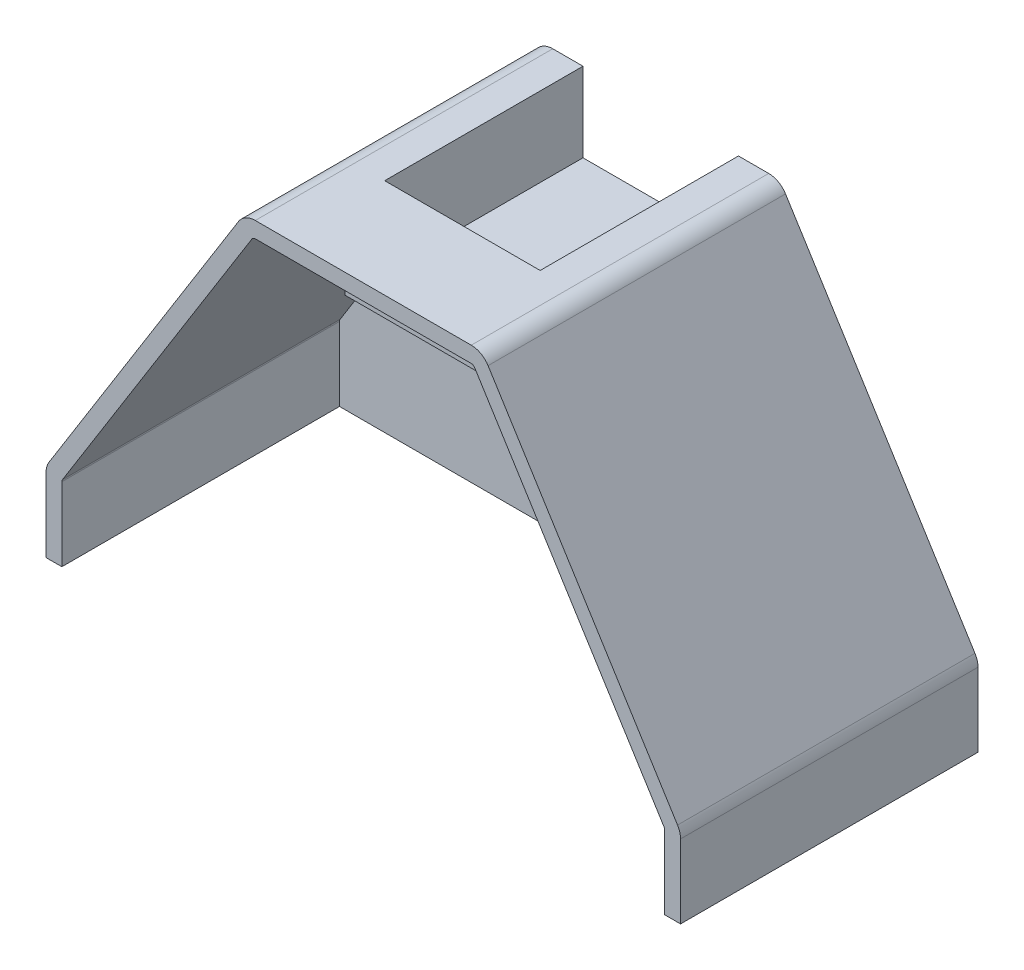
ISO-10303-21;
HEADER;
FILE_DESCRIPTION(('STEP AP214'),'2;1');
FILE_NAME('part.step','',(''),(''),'','','');
FILE_SCHEMA(('AUTOMOTIVE_DESIGN { 1 0 10303 214 1 1 1 1 }'));
ENDSEC;
DATA;
#1=APPLICATION_CONTEXT('core data for automotive mechanical design processes');
#2=APPLICATION_PROTOCOL_DEFINITION('international standard','automotive_design',2000,#1);
#3=PRODUCT_CONTEXT('',#1,'mechanical');
#4=PRODUCT('Part','Part','',(#3));
#5=PRODUCT_RELATED_PRODUCT_CATEGORY('part','',(#4));
#6=PRODUCT_DEFINITION_FORMATION('','',#4);
#7=PRODUCT_DEFINITION_CONTEXT('part definition',#1,'design');
#8=PRODUCT_DEFINITION('design','',#6,#7);
#9=PRODUCT_DEFINITION_SHAPE('','',#8);
#10=(LENGTH_UNIT() NAMED_UNIT(*) SI_UNIT(.MILLI.,.METRE.));
#11=(NAMED_UNIT(*) PLANE_ANGLE_UNIT() SI_UNIT($,.RADIAN.));
#12=(NAMED_UNIT(*) SI_UNIT($,.STERADIAN.) SOLID_ANGLE_UNIT());
#13=UNCERTAINTY_MEASURE_WITH_UNIT(LENGTH_MEASURE(1.E-05),#10,'distance_accuracy_value','');
#14=(GEOMETRIC_REPRESENTATION_CONTEXT(3) GLOBAL_UNCERTAINTY_ASSIGNED_CONTEXT((#13)) GLOBAL_UNIT_ASSIGNED_CONTEXT((#10,
#11,#12)) REPRESENTATION_CONTEXT('',''));
#15=CARTESIAN_POINT('',(0.,0.,0.));
#16=DIRECTION('',(0.,0.,1.));
#17=DIRECTION('',(1.,0.,0.));
#18=AXIS2_PLACEMENT_3D('',#15,#16,#17);
#19=CARTESIAN_POINT('',(-30.,0.,5.));
#20=DIRECTION('',(0.847998304005088,-0.52999894000318,0.));
#21=DIRECTION('',(0.52999894000318,0.847998304005088,0.));
#22=AXIS2_PLACEMENT_3D('',#19,#20,#21);
#23=PLANE('',#22);
#24=DIRECTION('',(-0.52999894000318,-0.847998304005088,0.));
#25=VECTOR('',#24,1.);
#26=CARTESIAN_POINT('',(-30.,0.,0.));
#27=LINE('',#26,#25);
#28=CARTESIAN_POINT('',(-31.4687533124901,-2.3500052999841,0.));
#29=VERTEX_POINT('',#28);
#30=CARTESIAN_POINT('',(-79.2399915200254,-78.7839864320407,0.));
#31=VERTEX_POINT('',#30);
#32=EDGE_CURVE('E382',#29,#31,#27,.T.);
#33=ORIENTED_EDGE('',*,*,#32,.T.);
#34=DIRECTION('',(0.,0.,-1.));
#35=VECTOR('',#34,1.);
#36=CARTESIAN_POINT('',(-79.2399915200254,-78.7839864320407,5.));
#37=LINE('',#36,#35);
#38=CARTESIAN_POINT('',(-79.2399915200254,-78.7839864320407,75.));
#39=VERTEX_POINT('',#38);
#40=EDGE_CURVE('E434',#31,#39,#37,.F.);
#41=ORIENTED_EDGE('',*,*,#40,.T.);
#42=DIRECTION('',(-0.52999894000318,-0.847998304005088,0.));
#43=VECTOR('',#42,1.);
#44=CARTESIAN_POINT('',(-31.4687533124901,-2.3500052999841,75.));
#45=LINE('',#44,#43);
#46=CARTESIAN_POINT('',(-31.4687533124901,-2.3500052999841,75.));
#47=VERTEX_POINT('',#46);
#48=EDGE_CURVE('E278',#47,#39,#45,.T.);
#49=ORIENTED_EDGE('',*,*,#48,.F.);
#50=DIRECTION('',(0.,0.,-1.));
#51=VECTOR('',#50,1.);
#52=CARTESIAN_POINT('',(-31.4687533124901,-2.3500052999841,5.));
#53=LINE('',#52,#51);
#54=EDGE_CURVE('E406',#47,#29,#53,.T.);
#55=ORIENTED_EDGE('',*,*,#54,.T.);
#56=EDGE_LOOP('',(#33,#41,#49,#55));
#57=FACE_BOUND('',#56,.T.);
#58=ADVANCED_FACE('F35',(#57),#23,.F.);
#59=CARTESIAN_POINT('',(-80.,-100.,5.));
#60=DIRECTION('',(1.,0.,0.));
#61=DIRECTION('',(0.,0.,-1.));
#62=AXIS2_PLACEMENT_3D('',#59,#60,#61);
#63=PLANE('',#62);
#64=DIRECTION('',(0.,0.,-1.));
#65=VECTOR('',#64,1.);
#66=CARTESIAN_POINT('',(-80.,-100.,5.));
#67=LINE('',#66,#65);
#68=CARTESIAN_POINT('',(-80.,-100.,75.));
#69=VERTEX_POINT('',#68);
#70=CARTESIAN_POINT('',(-80.,-100.,0.));
#71=VERTEX_POINT('',#70);
#72=EDGE_CURVE('E403',#69,#71,#67,.T.);
#73=ORIENTED_EDGE('',*,*,#72,.F.);
#74=DIRECTION('',(0.,-1.,0.));
#75=VECTOR('',#74,1.);
#76=CARTESIAN_POINT('',(-80.,-81.4339811320566,75.));
#77=LINE('',#76,#75);
#78=CARTESIAN_POINT('',(-80.,-81.4339811320566,75.));
#79=VERTEX_POINT('',#78);
#80=EDGE_CURVE('E285',#79,#69,#77,.T.);
#81=ORIENTED_EDGE('',*,*,#80,.F.);
#82=DIRECTION('',(0.,0.,-1.));
#83=VECTOR('',#82,1.);
#84=CARTESIAN_POINT('',(-80.,-81.4339811320566,5.));
#85=LINE('',#84,#83);
#86=CARTESIAN_POINT('',(-80.,-81.4339811320566,0.));
#87=VERTEX_POINT('',#86);
#88=EDGE_CURVE('E429',#79,#87,#85,.T.);
#89=ORIENTED_EDGE('',*,*,#88,.T.);
#90=DIRECTION('',(0.,-1.,0.));
#91=VECTOR('',#90,1.);
#92=CARTESIAN_POINT('',(-80.,-100.,0.));
#93=LINE('',#92,#91);
#94=EDGE_CURVE('E389',#87,#71,#93,.T.);
#95=ORIENTED_EDGE('',*,*,#94,.T.);
#96=EDGE_LOOP('',(#73,#81,#89,#95));
#97=FACE_BOUND('',#96,.T.);
#98=ADVANCED_FACE('F502',(#97),#63,.F.);
#99=CARTESIAN_POINT('',(-80.,-100.,5.));
#100=DIRECTION('',(0.,1.,0.));
#101=DIRECTION('',(0.,0.,1.));
#102=AXIS2_PLACEMENT_3D('',#99,#100,#101);
#103=PLANE('',#102);
#104=DIRECTION('',(1.,0.,0.));
#105=VECTOR('',#104,1.);
#106=CARTESIAN_POINT('',(-80.,-100.,0.));
#107=LINE('',#106,#105);
#108=CARTESIAN_POINT('',(80.,-100.,0.));
#109=VERTEX_POINT('',#108);
#110=EDGE_CURVE('E391',#71,#109,#107,.T.);
#111=ORIENTED_EDGE('',*,*,#110,.T.);
#112=DIRECTION('',(0.,0.,-1.));
#113=VECTOR('',#112,1.);
#114=CARTESIAN_POINT('',(80.,-100.,5.));
#115=LINE('',#114,#113);
#116=CARTESIAN_POINT('',(80.,-100.,75.));
#117=VERTEX_POINT('',#116);
#118=EDGE_CURVE('E385',#117,#109,#115,.T.);
#119=ORIENTED_EDGE('',*,*,#118,.F.);
#120=DIRECTION('',(1.,0.,0.));
#121=VECTOR('',#120,1.);
#122=CARTESIAN_POINT('',(76.,-100.,75.));
#123=LINE('',#122,#121);
#124=CARTESIAN_POINT('',(76.,-100.,75.));
#125=VERTEX_POINT('',#124);
#126=EDGE_CURVE('E308',#125,#117,#123,.T.);
#127=ORIENTED_EDGE('',*,*,#126,.F.);
#128=DIRECTION('',(0.,0.,-1.));
#129=VECTOR('',#128,1.);
#130=CARTESIAN_POINT('',(76.,-100.,75.));
#131=LINE('',#130,#129);
#132=CARTESIAN_POINT('',(76.,-100.,5.));
#133=VERTEX_POINT('',#132);
#134=EDGE_CURVE('E326',#125,#133,#131,.T.);
#135=ORIENTED_EDGE('',*,*,#134,.T.);
#136=DIRECTION('',(1.,0.,0.));
#137=VECTOR('',#136,1.);
#138=CARTESIAN_POINT('',(-80.,-100.,5.));
#139=LINE('',#138,#137);
#140=CARTESIAN_POINT('',(-76.,-100.,5.));
#141=VERTEX_POINT('',#140);
#142=EDGE_CURVE('E383',#141,#133,#139,.T.);
#143=ORIENTED_EDGE('',*,*,#142,.F.);
#144=DIRECTION('',(0.,0.,-1.));
#145=VECTOR('',#144,1.);
#146=CARTESIAN_POINT('',(-76.,-100.,75.));
#147=LINE('',#146,#145);
#148=CARTESIAN_POINT('',(-76.,-100.,75.));
#149=VERTEX_POINT('',#148);
#150=EDGE_CURVE('E379',#149,#141,#147,.T.);
#151=ORIENTED_EDGE('',*,*,#150,.F.);
#152=DIRECTION('',(1.,0.,0.));
#153=VECTOR('',#152,1.);
#154=CARTESIAN_POINT('',(-80.,-100.,75.));
#155=LINE('',#154,#153);
#156=EDGE_CURVE('E288',#69,#149,#155,.T.);
#157=ORIENTED_EDGE('',*,*,#156,.F.);
#158=ORIENTED_EDGE('',*,*,#72,.T.);
#159=EDGE_LOOP('',(#111,#119,#127,#135,#143,#151,#157,#158));
#160=FACE_BOUND('',#159,.T.);
#161=ADVANCED_FACE('F479',(#160),#103,.F.);
#162=CARTESIAN_POINT('',(80.,-100.,5.));
#163=DIRECTION('',(-1.,0.,0.));
#164=DIRECTION('',(0.,0.,1.));
#165=AXIS2_PLACEMENT_3D('',#162,#163,#164);
#166=PLANE('',#165);
#167=DIRECTION('',(0.,1.,0.));
#168=VECTOR('',#167,1.);
#169=CARTESIAN_POINT('',(80.,-100.,0.));
#170=LINE('',#169,#168);
#171=CARTESIAN_POINT('',(80.,-81.4339811320566,0.));
#172=VERTEX_POINT('',#171);
#173=EDGE_CURVE('E393',#109,#172,#170,.T.);
#174=ORIENTED_EDGE('',*,*,#173,.T.);
#175=DIRECTION('',(0.,0.,-1.));
#176=VECTOR('',#175,1.);
#177=CARTESIAN_POINT('',(80.,-81.4339811320566,5.));
#178=LINE('',#177,#176);
#179=CARTESIAN_POINT('',(80.,-81.4339811320566,75.));
#180=VERTEX_POINT('',#179);
#181=EDGE_CURVE('E427',#172,#180,#178,.F.);
#182=ORIENTED_EDGE('',*,*,#181,.T.);
#183=DIRECTION('',(0.,1.,0.));
#184=VECTOR('',#183,1.);
#185=CARTESIAN_POINT('',(80.,-100.,75.));
#186=LINE('',#185,#184);
#187=EDGE_CURVE('E311',#117,#180,#186,.T.);
#188=ORIENTED_EDGE('',*,*,#187,.F.);
#189=ORIENTED_EDGE('',*,*,#118,.T.);
#190=EDGE_LOOP('',(#174,#182,#188,#189));
#191=FACE_BOUND('',#190,.T.);
#192=ADVANCED_FACE('F512',(#191),#166,.F.);
#193=CARTESIAN_POINT('',(30.,0.,5.));
#194=DIRECTION('',(-0.847998304005088,-0.52999894000318,0.));
#195=DIRECTION('',(0.52999894000318,-0.847998304005088,0.));
#196=AXIS2_PLACEMENT_3D('',#193,#194,#195);
#197=PLANE('',#196);
#198=DIRECTION('',(0.,0.,-1.));
#199=VECTOR('',#198,1.);
#200=CARTESIAN_POINT('',(31.4687533124901,-2.3500052999841,5.));
#201=LINE('',#200,#199);
#202=CARTESIAN_POINT('',(31.4687533124901,-2.3500052999841,0.));
#203=VERTEX_POINT('',#202);
#204=CARTESIAN_POINT('',(31.4687533124901,-2.3500052999841,75.));
#205=VERTEX_POINT('',#204);
#206=EDGE_CURVE('E420',#203,#205,#201,.F.);
#207=ORIENTED_EDGE('',*,*,#206,.T.);
#208=DIRECTION('',(-0.52999894000318,0.847998304005088,0.));
#209=VECTOR('',#208,1.);
#210=CARTESIAN_POINT('',(79.2399915200255,-78.7839864320407,75.));
#211=LINE('',#210,#209);
#212=CARTESIAN_POINT('',(79.2399915200255,-78.7839864320407,75.));
#213=VERTEX_POINT('',#212);
#214=EDGE_CURVE('E317',#213,#205,#211,.T.);
#215=ORIENTED_EDGE('',*,*,#214,.F.);
#216=DIRECTION('',(0.,0.,-1.));
#217=VECTOR('',#216,1.);
#218=CARTESIAN_POINT('',(79.2399915200255,-78.7839864320407,5.));
#219=LINE('',#218,#217);
#220=CARTESIAN_POINT('',(79.2399915200255,-78.7839864320407,0.));
#221=VERTEX_POINT('',#220);
#222=EDGE_CURVE('E422',#213,#221,#219,.T.);
#223=ORIENTED_EDGE('',*,*,#222,.T.);
#224=DIRECTION('',(-0.52999894000318,0.847998304005088,0.));
#225=VECTOR('',#224,1.);
#226=CARTESIAN_POINT('',(30.,0.,0.));
#227=LINE('',#226,#225);
#228=EDGE_CURVE('E396',#221,#203,#227,.T.);
#229=ORIENTED_EDGE('',*,*,#228,.T.);
#230=EDGE_LOOP('',(#207,#215,#223,#229));
#231=FACE_BOUND('',#230,.T.);
#232=ADVANCED_FACE('F520',(#231),#197,.F.);
#233=CARTESIAN_POINT('',(-30.,0.,5.));
#234=DIRECTION('',(0.,-1.,0.));
#235=DIRECTION('',(0.,0.,-1.));
#236=AXIS2_PLACEMENT_3D('',#233,#234,#235);
#237=PLANE('',#236);
#238=DIRECTION('',(1.,0.,0.));
#239=VECTOR('',#238,1.);
#240=CARTESIAN_POINT('',(-19.6,0.,50.));
#241=LINE('',#240,#239);
#242=CARTESIAN_POINT('',(-19.6,0.,50.));
#243=VERTEX_POINT('',#242);
#244=CARTESIAN_POINT('',(19.6,0.,50.));
#245=VERTEX_POINT('',#244);
#246=EDGE_CURVE('E241',#243,#245,#241,.T.);
#247=ORIENTED_EDGE('',*,*,#246,.F.);
#248=DIRECTION('',(0.,0.,1.));
#249=VECTOR('',#248,1.);
#250=CARTESIAN_POINT('',(-19.6,0.,0.));
#251=LINE('',#250,#249);
#252=CARTESIAN_POINT('',(-19.6,0.,0.));
#253=VERTEX_POINT('',#252);
#254=EDGE_CURVE('E226',#253,#243,#251,.T.);
#255=ORIENTED_EDGE('',*,*,#254,.F.);
#256=DIRECTION('',(-1.,0.,0.));
#257=VECTOR('',#256,1.);
#258=CARTESIAN_POINT('',(-30.,0.,0.));
#259=LINE('',#258,#257);
#260=CARTESIAN_POINT('',(-27.2287617924646,0.,0.));
#261=VERTEX_POINT('',#260);
#262=EDGE_CURVE('E398',#253,#261,#259,.T.);
#263=ORIENTED_EDGE('',*,*,#262,.T.);
#264=DIRECTION('',(0.,0.,-1.));
#265=VECTOR('',#264,1.);
#266=CARTESIAN_POINT('',(-27.2287617924646,0.,5.));
#267=LINE('',#266,#265);
#268=CARTESIAN_POINT('',(-27.2287617924646,0.,75.));
#269=VERTEX_POINT('',#268);
#270=EDGE_CURVE('E412',#261,#269,#267,.F.);
#271=ORIENTED_EDGE('',*,*,#270,.T.);
#272=DIRECTION('',(-1.,0.,0.));
#273=VECTOR('',#272,1.);
#274=CARTESIAN_POINT('',(27.2287617924646,0.,75.));
#275=LINE('',#274,#273);
#276=CARTESIAN_POINT('',(27.2287617924646,0.,75.));
#277=VERTEX_POINT('',#276);
#278=EDGE_CURVE('E323',#277,#269,#275,.T.);
#279=ORIENTED_EDGE('',*,*,#278,.F.);
#280=DIRECTION('',(0.,0.,-1.));
#281=VECTOR('',#280,1.);
#282=CARTESIAN_POINT('',(27.2287617924646,0.,5.));
#283=LINE('',#282,#281);
#284=CARTESIAN_POINT('',(27.2287617924646,0.,0.));
#285=VERTEX_POINT('',#284);
#286=EDGE_CURVE('E414',#277,#285,#283,.T.);
#287=ORIENTED_EDGE('',*,*,#286,.T.);
#288=CARTESIAN_POINT('',(19.6,0.,0.));
#289=VERTEX_POINT('',#288);
#290=EDGE_CURVE('E386',#285,#289,#259,.T.);
#291=ORIENTED_EDGE('',*,*,#290,.T.);
#292=DIRECTION('',(0.,0.,-1.));
#293=VECTOR('',#292,1.);
#294=CARTESIAN_POINT('',(19.6,0.,0.));
#295=LINE('',#294,#293);
#296=EDGE_CURVE('E239',#245,#289,#295,.T.);
#297=ORIENTED_EDGE('',*,*,#296,.F.);
#298=EDGE_LOOP('',(#247,#255,#263,#271,#279,#287,#291,#297));
#299=FACE_BOUND('',#298,.T.);
#300=ADVANCED_FACE('F527',(#299),#237,.F.);
#301=CARTESIAN_POINT('',(0.,0.,5.));
#302=DIRECTION('',(0.,0.,1.));
#303=DIRECTION('',(1.,0.,0.));
#304=AXIS2_PLACEMENT_3D('',#301,#302,#303);
#305=PLANE('',#304);
#306=DIRECTION('',(0.,-1.,0.));
#307=VECTOR('',#306,1.);
#308=CARTESIAN_POINT('',(-24.6,0.,5.));
#309=LINE('',#308,#307);
#310=CARTESIAN_POINT('',(-24.6,-4.,5.));
#311=VERTEX_POINT('',#310);
#312=CARTESIAN_POINT('',(-24.6,-25.,5.));
#313=VERTEX_POINT('',#312);
#314=EDGE_CURVE('E271',#311,#313,#309,.T.);
#315=ORIENTED_EDGE('',*,*,#314,.F.);
#316=DIRECTION('',(1.,0.,0.));
#317=VECTOR('',#316,1.);
#318=CARTESIAN_POINT('',(27.2287617924646,-4.,5.));
#319=LINE('',#318,#317);
#320=CARTESIAN_POINT('',(-27.2287617924646,-4.,5.));
#321=VERTEX_POINT('',#320);
#322=EDGE_CURVE('E339',#321,#311,#319,.T.);
#323=ORIENTED_EDGE('',*,*,#322,.F.);
#324=CARTESIAN_POINT('',(-27.2287617924646,-5.,5.));
#325=DIRECTION('',(0.,0.,-1.));
#326=DIRECTION('',(1.,0.,0.));
#327=AXIS2_PLACEMENT_3D('',#324,#325,#326);
#328=CIRCLE('',#327,1.);
#329=CARTESIAN_POINT('',(-28.0767600964697,-4.47000105999682,5.));
#330=VERTEX_POINT('',#329);
#331=EDGE_CURVE('E335',#330,#321,#328,.T.);
#332=ORIENTED_EDGE('',*,*,#331,.F.);
#333=DIRECTION('',(0.52999894000318,0.847998304005088,0.));
#334=VECTOR('',#333,1.);
#335=CARTESIAN_POINT('',(-28.0767600964697,-4.47000105999682,5.));
#336=LINE('',#335,#334);
#337=CARTESIAN_POINT('',(-75.8479983040051,-80.9039821920534,5.));
#338=VERTEX_POINT('',#337);
#339=EDGE_CURVE('E332',#338,#330,#336,.T.);
#340=ORIENTED_EDGE('',*,*,#339,.F.);
#341=CARTESIAN_POINT('',(-75.,-81.4339811320566,5.));
#342=DIRECTION('',(0.,0.,-1.));
#343=DIRECTION('',(1.,0.,0.));
#344=AXIS2_PLACEMENT_3D('',#341,#342,#343);
#345=CIRCLE('',#344,0.999999999999992);
#346=CARTESIAN_POINT('',(-76.,-81.4339811320566,5.));
#347=VERTEX_POINT('',#346);
#348=EDGE_CURVE('E329',#347,#338,#345,.T.);
#349=ORIENTED_EDGE('',*,*,#348,.F.);
#350=DIRECTION('',(0.,1.,0.));
#351=VECTOR('',#350,1.);
#352=CARTESIAN_POINT('',(-76.,-81.4339811320566,5.));
#353=LINE('',#352,#351);
#354=EDGE_CURVE('E274',#141,#347,#353,.T.);
#355=ORIENTED_EDGE('',*,*,#354,.F.);
#356=ORIENTED_EDGE('',*,*,#142,.T.);
#357=DIRECTION('',(0.,-1.,0.));
#358=VECTOR('',#357,1.);
#359=CARTESIAN_POINT('',(76.,-100.,5.));
#360=LINE('',#359,#358);
#361=CARTESIAN_POINT('',(76.,-81.4339811320566,5.));
#362=VERTEX_POINT('',#361);
#363=EDGE_CURVE('E279',#362,#133,#360,.T.);
#364=ORIENTED_EDGE('',*,*,#363,.F.);
#365=CARTESIAN_POINT('',(75.,-81.4339811320566,5.));
#366=DIRECTION('',(0.,0.,-1.));
#367=DIRECTION('',(1.,0.,0.));
#368=AXIS2_PLACEMENT_3D('',#365,#366,#367);
#369=CIRCLE('',#368,0.999999999999999);
#370=CARTESIAN_POINT('',(75.8479983040051,-80.9039821920534,5.));
#371=VERTEX_POINT('',#370);
#372=EDGE_CURVE('E348',#371,#362,#369,.T.);
#373=ORIENTED_EDGE('',*,*,#372,.F.);
#374=DIRECTION('',(0.52999894000318,-0.847998304005088,0.));
#375=VECTOR('',#374,1.);
#376=CARTESIAN_POINT('',(75.8479983040051,-80.9039821920534,5.));
#377=LINE('',#376,#375);
#378=CARTESIAN_POINT('',(28.0767600964697,-4.47000105999683,5.));
#379=VERTEX_POINT('',#378);
#380=EDGE_CURVE('E345',#379,#371,#377,.T.);
#381=ORIENTED_EDGE('',*,*,#380,.F.);
#382=CARTESIAN_POINT('',(27.2287617924646,-5.,5.));
#383=DIRECTION('',(0.,0.,-1.));
#384=DIRECTION('',(1.,0.,0.));
#385=AXIS2_PLACEMENT_3D('',#382,#383,#384);
#386=CIRCLE('',#385,0.999999999999997);
#387=CARTESIAN_POINT('',(27.2287617924646,-4.,5.));
#388=VERTEX_POINT('',#387);
#389=EDGE_CURVE('E342',#388,#379,#386,.T.);
#390=ORIENTED_EDGE('',*,*,#389,.F.);
#391=CARTESIAN_POINT('',(24.6,-4.,5.));
#392=VERTEX_POINT('',#391);
#393=EDGE_CURVE('E338',#392,#388,#319,.T.);
#394=ORIENTED_EDGE('',*,*,#393,.F.);
#395=DIRECTION('',(0.,1.,0.));
#396=VECTOR('',#395,1.);
#397=CARTESIAN_POINT('',(24.6,0.,5.));
#398=LINE('',#397,#396);
#399=CARTESIAN_POINT('',(24.6,-25.,5.));
#400=VERTEX_POINT('',#399);
#401=EDGE_CURVE('E266',#400,#392,#398,.T.);
#402=ORIENTED_EDGE('',*,*,#401,.F.);
#403=DIRECTION('',(1.,0.,0.));
#404=VECTOR('',#403,1.);
#405=CARTESIAN_POINT('',(0.,-25.,5.));
#406=LINE('',#405,#404);
#407=EDGE_CURVE('E58',#313,#400,#406,.T.);
#408=ORIENTED_EDGE('',*,*,#407,.F.);
#409=EDGE_LOOP('',(#315,#323,#332,#340,#349,#355,#356,#364,#373,#381,#390,#394,#402,#408));
#410=FACE_BOUND('',#409,.T.);
#411=ADVANCED_FACE('F446',(#410),#305,.T.);
#412=CARTESIAN_POINT('',(0.,0.,0.));
#413=DIRECTION('',(0.,0.,1.));
#414=DIRECTION('',(1.,0.,0.));
#415=AXIS2_PLACEMENT_3D('',#412,#413,#414);
#416=PLANE('',#415);
#417=ORIENTED_EDGE('',*,*,#262,.F.);
#418=DIRECTION('',(0.,1.,0.));
#419=VECTOR('',#418,1.);
#420=CARTESIAN_POINT('',(-19.6,-20.,0.));
#421=LINE('',#420,#419);
#422=CARTESIAN_POINT('',(-19.6,-20.,0.));
#423=VERTEX_POINT('',#422);
#424=EDGE_CURVE('E248',#423,#253,#421,.T.);
#425=ORIENTED_EDGE('',*,*,#424,.F.);
#426=DIRECTION('',(-1.,0.,0.));
#427=VECTOR('',#426,1.);
#428=CARTESIAN_POINT('',(-19.6,-20.,0.));
#429=LINE('',#428,#427);
#430=CARTESIAN_POINT('',(19.6,-20.,0.));
#431=VERTEX_POINT('',#430);
#432=EDGE_CURVE('E231',#431,#423,#429,.T.);
#433=ORIENTED_EDGE('',*,*,#432,.F.);
#434=DIRECTION('',(0.,1.,0.));
#435=VECTOR('',#434,1.);
#436=CARTESIAN_POINT('',(19.6,-20.,0.));
#437=LINE('',#436,#435);
#438=EDGE_CURVE('E251',#431,#289,#437,.T.);
#439=ORIENTED_EDGE('',*,*,#438,.T.);
#440=ORIENTED_EDGE('',*,*,#290,.F.);
#441=CARTESIAN_POINT('',(27.2287617924646,-5.,0.));
#442=DIRECTION('',(0.,0.,1.));
#443=DIRECTION('',(1.,0.,0.));
#444=AXIS2_PLACEMENT_3D('',#441,#442,#443);
#445=CIRCLE('',#444,5.);
#446=EDGE_CURVE('E417',#285,#203,#445,.F.);
#447=ORIENTED_EDGE('',*,*,#446,.T.);
#448=ORIENTED_EDGE('',*,*,#228,.F.);
#449=CARTESIAN_POINT('',(75.,-81.4339811320566,0.));
#450=DIRECTION('',(0.,0.,1.));
#451=DIRECTION('',(1.,0.,0.));
#452=AXIS2_PLACEMENT_3D('',#449,#450,#451);
#453=CIRCLE('',#452,5.);
#454=EDGE_CURVE('E425',#221,#172,#453,.F.);
#455=ORIENTED_EDGE('',*,*,#454,.T.);
#456=ORIENTED_EDGE('',*,*,#173,.F.);
#457=ORIENTED_EDGE('',*,*,#110,.F.);
#458=ORIENTED_EDGE('',*,*,#94,.F.);
#459=CARTESIAN_POINT('',(-75.,-81.4339811320566,0.));
#460=DIRECTION('',(0.,0.,1.));
#461=DIRECTION('',(1.,0.,0.));
#462=AXIS2_PLACEMENT_3D('',#459,#460,#461);
#463=CIRCLE('',#462,5.);
#464=EDGE_CURVE('E432',#87,#31,#463,.F.);
#465=ORIENTED_EDGE('',*,*,#464,.T.);
#466=ORIENTED_EDGE('',*,*,#32,.F.);
#467=CARTESIAN_POINT('',(-27.2287617924646,-5.,0.));
#468=DIRECTION('',(0.,0.,1.));
#469=DIRECTION('',(1.,0.,0.));
#470=AXIS2_PLACEMENT_3D('',#467,#468,#469);
#471=CIRCLE('',#470,5.);
#472=EDGE_CURVE('E409',#29,#261,#471,.F.);
#473=ORIENTED_EDGE('',*,*,#472,.T.);
#474=EDGE_LOOP('',(#417,#425,#433,#439,#440,#447,#448,#455,#456,#457,#458,#465,#466,#473));
#475=FACE_BOUND('',#474,.T.);
#476=ADVANCED_FACE('F508',(#475),#416,.F.);
#477=CARTESIAN_POINT('',(-27.2287617924646,-5.,5.));
#478=DIRECTION('',(0.,0.,-1.));
#479=DIRECTION('',(-1.,0.,0.));
#480=AXIS2_PLACEMENT_3D('',#477,#478,#479);
#481=CYLINDRICAL_SURFACE('',#480,5.);
#482=ORIENTED_EDGE('',*,*,#54,.F.);
#483=CARTESIAN_POINT('',(-27.2287617924646,-5.,75.));
#484=DIRECTION('',(0.,0.,1.));
#485=DIRECTION('',(1.,0.,0.));
#486=AXIS2_PLACEMENT_3D('',#483,#484,#485);
#487=CIRCLE('',#486,5.);
#488=EDGE_CURVE('E275',#269,#47,#487,.T.);
#489=ORIENTED_EDGE('',*,*,#488,.F.);
#490=ORIENTED_EDGE('',*,*,#270,.F.);
#491=ORIENTED_EDGE('',*,*,#472,.F.);
#492=EDGE_LOOP('',(#482,#489,#490,#491));
#493=FACE_BOUND('',#492,.T.);
#494=ADVANCED_FACE('F531',(#493),#481,.T.);
#495=CARTESIAN_POINT('',(27.2287617924646,-5.,5.));
#496=DIRECTION('',(0.,0.,-1.));
#497=DIRECTION('',(-1.,0.,0.));
#498=AXIS2_PLACEMENT_3D('',#495,#496,#497);
#499=CYLINDRICAL_SURFACE('',#498,5.);
#500=ORIENTED_EDGE('',*,*,#286,.F.);
#501=CARTESIAN_POINT('',(27.2287617924646,-5.,75.));
#502=DIRECTION('',(0.,0.,1.));
#503=DIRECTION('',(1.,0.,0.));
#504=AXIS2_PLACEMENT_3D('',#501,#502,#503);
#505=CIRCLE('',#504,5.);
#506=EDGE_CURVE('E320',#205,#277,#505,.T.);
#507=ORIENTED_EDGE('',*,*,#506,.F.);
#508=ORIENTED_EDGE('',*,*,#206,.F.);
#509=ORIENTED_EDGE('',*,*,#446,.F.);
#510=EDGE_LOOP('',(#500,#507,#508,#509));
#511=FACE_BOUND('',#510,.T.);
#512=ADVANCED_FACE('F523',(#511),#499,.T.);
#513=CARTESIAN_POINT('',(75.,-81.4339811320566,5.));
#514=DIRECTION('',(0.,0.,-1.));
#515=DIRECTION('',(-1.,0.,0.));
#516=AXIS2_PLACEMENT_3D('',#513,#514,#515);
#517=CYLINDRICAL_SURFACE('',#516,5.);
#518=ORIENTED_EDGE('',*,*,#222,.F.);
#519=CARTESIAN_POINT('',(75.,-81.4339811320566,75.));
#520=DIRECTION('',(0.,0.,1.));
#521=DIRECTION('',(1.,0.,0.));
#522=AXIS2_PLACEMENT_3D('',#519,#520,#521);
#523=CIRCLE('',#522,5.);
#524=EDGE_CURVE('E314',#180,#213,#523,.T.);
#525=ORIENTED_EDGE('',*,*,#524,.F.);
#526=ORIENTED_EDGE('',*,*,#181,.F.);
#527=ORIENTED_EDGE('',*,*,#454,.F.);
#528=EDGE_LOOP('',(#518,#525,#526,#527));
#529=FACE_BOUND('',#528,.T.);
#530=ADVANCED_FACE('F516',(#529),#517,.T.);
#531=CARTESIAN_POINT('',(-75.,-81.4339811320566,5.));
#532=DIRECTION('',(0.,0.,-1.));
#533=DIRECTION('',(-1.,0.,0.));
#534=AXIS2_PLACEMENT_3D('',#531,#532,#533);
#535=CYLINDRICAL_SURFACE('',#534,5.);
#536=ORIENTED_EDGE('',*,*,#88,.F.);
#537=CARTESIAN_POINT('',(-75.,-81.4339811320566,75.));
#538=DIRECTION('',(0.,0.,1.));
#539=DIRECTION('',(1.,0.,0.));
#540=AXIS2_PLACEMENT_3D('',#537,#538,#539);
#541=CIRCLE('',#540,4.99999999999999);
#542=EDGE_CURVE('E282',#39,#79,#541,.T.);
#543=ORIENTED_EDGE('',*,*,#542,.F.);
#544=ORIENTED_EDGE('',*,*,#40,.F.);
#545=ORIENTED_EDGE('',*,*,#464,.F.);
#546=EDGE_LOOP('',(#536,#543,#544,#545));
#547=FACE_BOUND('',#546,.T.);
#548=ADVANCED_FACE('F37',(#547),#535,.T.);
#549=CARTESIAN_POINT('',(-76.,-81.4339811320566,75.));
#550=DIRECTION('',(-1.,0.,0.));
#551=DIRECTION('',(0.,0.,1.));
#552=AXIS2_PLACEMENT_3D('',#549,#550,#551);
#553=PLANE('',#552);
#554=ORIENTED_EDGE('',*,*,#354,.T.);
#555=DIRECTION('',(0.,0.,-1.));
#556=VECTOR('',#555,1.);
#557=CARTESIAN_POINT('',(-76.,-81.4339811320566,75.));
#558=LINE('',#557,#556);
#559=CARTESIAN_POINT('',(-76.,-81.4339811320566,75.));
#560=VERTEX_POINT('',#559);
#561=EDGE_CURVE('E376',#560,#347,#558,.T.);
#562=ORIENTED_EDGE('',*,*,#561,.F.);
#563=DIRECTION('',(0.,1.,0.));
#564=VECTOR('',#563,1.);
#565=CARTESIAN_POINT('',(-76.,-81.4339811320566,75.));
#566=LINE('',#565,#564);
#567=EDGE_CURVE('E290',#149,#560,#566,.T.);
#568=ORIENTED_EDGE('',*,*,#567,.F.);
#569=ORIENTED_EDGE('',*,*,#150,.T.);
#570=EDGE_LOOP('',(#554,#562,#568,#569));
#571=FACE_BOUND('',#570,.T.);
#572=ADVANCED_FACE('F474',(#571),#553,.F.);
#573=CARTESIAN_POINT('',(-75.,-81.4339811320566,75.));
#574=DIRECTION('',(0.,0.,-1.));
#575=DIRECTION('',(-1.,0.,0.));
#576=AXIS2_PLACEMENT_3D('',#573,#574,#575);
#577=CYLINDRICAL_SURFACE('',#576,0.999999999999992);
#578=ORIENTED_EDGE('',*,*,#348,.T.);
#579=DIRECTION('',(0.,0.,-1.));
#580=VECTOR('',#579,1.);
#581=CARTESIAN_POINT('',(-75.8479983040051,-80.9039821920534,75.));
#582=LINE('',#581,#580);
#583=CARTESIAN_POINT('',(-75.8479983040051,-80.9039821920534,75.));
#584=VERTEX_POINT('',#583);
#585=EDGE_CURVE('E373',#584,#338,#582,.T.);
#586=ORIENTED_EDGE('',*,*,#585,.F.);
#587=CARTESIAN_POINT('',(-75.,-81.4339811320566,75.));
#588=DIRECTION('',(0.,0.,-1.));
#589=DIRECTION('',(1.,0.,0.));
#590=AXIS2_PLACEMENT_3D('',#587,#588,#589);
#591=CIRCLE('',#590,0.999999999999992);
#592=EDGE_CURVE('E292',#560,#584,#591,.T.);
#593=ORIENTED_EDGE('',*,*,#592,.F.);
#594=ORIENTED_EDGE('',*,*,#561,.T.);
#595=EDGE_LOOP('',(#578,#586,#593,#594));
#596=FACE_BOUND('',#595,.T.);
#597=ADVANCED_FACE('F470',(#596),#577,.F.);
#598=CARTESIAN_POINT('',(-28.0767600964697,-4.47000105999682,75.));
#599=DIRECTION('',(-0.847998304005088,0.52999894000318,0.));
#600=DIRECTION('',(-0.52999894000318,-0.847998304005088,0.));
#601=AXIS2_PLACEMENT_3D('',#598,#599,#600);
#602=PLANE('',#601);
#603=ORIENTED_EDGE('',*,*,#339,.T.);
#604=DIRECTION('',(0.,0.,-1.));
#605=VECTOR('',#604,1.);
#606=CARTESIAN_POINT('',(-28.0767600964697,-4.47000105999682,75.));
#607=LINE('',#606,#605);
#608=CARTESIAN_POINT('',(-28.0767600964697,-4.47000105999682,75.));
#609=VERTEX_POINT('',#608);
#610=EDGE_CURVE('E370',#609,#330,#607,.T.);
#611=ORIENTED_EDGE('',*,*,#610,.F.);
#612=DIRECTION('',(0.52999894000318,0.847998304005088,0.));
#613=VECTOR('',#612,1.);
#614=CARTESIAN_POINT('',(-28.0767600964697,-4.47000105999682,75.));
#615=LINE('',#614,#613);
#616=EDGE_CURVE('E294',#584,#609,#615,.T.);
#617=ORIENTED_EDGE('',*,*,#616,.F.);
#618=ORIENTED_EDGE('',*,*,#585,.T.);
#619=EDGE_LOOP('',(#603,#611,#617,#618));
#620=FACE_BOUND('',#619,.T.);
#621=ADVANCED_FACE('F465',(#620),#602,.F.);
#622=CARTESIAN_POINT('',(-27.2287617924646,-5.,75.));
#623=DIRECTION('',(0.,0.,-1.));
#624=DIRECTION('',(-1.,0.,0.));
#625=AXIS2_PLACEMENT_3D('',#622,#623,#624);
#626=CYLINDRICAL_SURFACE('',#625,1.);
#627=ORIENTED_EDGE('',*,*,#331,.T.);
#628=DIRECTION('',(0.,0.,-1.));
#629=VECTOR('',#628,1.);
#630=CARTESIAN_POINT('',(-27.2287617924646,-4.,75.));
#631=LINE('',#630,#629);
#632=CARTESIAN_POINT('',(-27.2287617924646,-4.,75.));
#633=VERTEX_POINT('',#632);
#634=EDGE_CURVE('E367',#633,#321,#631,.T.);
#635=ORIENTED_EDGE('',*,*,#634,.F.);
#636=CARTESIAN_POINT('',(-27.2287617924646,-5.,75.));
#637=DIRECTION('',(0.,0.,-1.));
#638=DIRECTION('',(1.,0.,0.));
#639=AXIS2_PLACEMENT_3D('',#636,#637,#638);
#640=CIRCLE('',#639,1.);
#641=EDGE_CURVE('E296',#609,#633,#640,.T.);
#642=ORIENTED_EDGE('',*,*,#641,.F.);
#643=ORIENTED_EDGE('',*,*,#610,.T.);
#644=EDGE_LOOP('',(#627,#635,#642,#643));
#645=FACE_BOUND('',#644,.T.);
#646=ADVANCED_FACE('F462',(#645),#626,.F.);
#647=CARTESIAN_POINT('',(27.2287617924646,-4.,75.));
#648=DIRECTION('',(0.,1.,0.));
#649=DIRECTION('',(-1.,0.,0.));
#650=AXIS2_PLACEMENT_3D('',#647,#648,#649);
#651=PLANE('',#650);
#652=ORIENTED_EDGE('',*,*,#322,.T.);
#653=DIRECTION('',(0.,0.,1.));
#654=VECTOR('',#653,1.);
#655=CARTESIAN_POINT('',(-24.6,-4.,75.));
#656=LINE('',#655,#654);
#657=CARTESIAN_POINT('',(-24.6,-4.,55.));
#658=VERTEX_POINT('',#657);
#659=EDGE_CURVE('E11',#311,#658,#656,.T.);
#660=ORIENTED_EDGE('',*,*,#659,.T.);
#661=DIRECTION('',(-1.,0.,0.));
#662=VECTOR('',#661,1.);
#663=CARTESIAN_POINT('',(27.2287617924646,-4.,55.));
#664=LINE('',#663,#662);
#665=CARTESIAN_POINT('',(24.6,-4.,55.));
#666=VERTEX_POINT('',#665);
#667=EDGE_CURVE('E436',#666,#658,#664,.T.);
#668=ORIENTED_EDGE('',*,*,#667,.F.);
#669=DIRECTION('',(0.,0.,-1.));
#670=VECTOR('',#669,1.);
#671=CARTESIAN_POINT('',(24.6,-4.,75.));
#672=LINE('',#671,#670);
#673=EDGE_CURVE('E43',#666,#392,#672,.T.);
#674=ORIENTED_EDGE('',*,*,#673,.T.);
#675=ORIENTED_EDGE('',*,*,#393,.T.);
#676=DIRECTION('',(0.,0.,-1.));
#677=VECTOR('',#676,1.);
#678=CARTESIAN_POINT('',(27.2287617924646,-4.,75.));
#679=LINE('',#678,#677);
#680=CARTESIAN_POINT('',(27.2287617924646,-4.,75.));
#681=VERTEX_POINT('',#680);
#682=EDGE_CURVE('E364',#681,#388,#679,.T.);
#683=ORIENTED_EDGE('',*,*,#682,.F.);
#684=DIRECTION('',(1.,0.,0.));
#685=VECTOR('',#684,1.);
#686=CARTESIAN_POINT('',(27.2287617924646,-4.,75.));
#687=LINE('',#686,#685);
#688=EDGE_CURVE('E298',#633,#681,#687,.T.);
#689=ORIENTED_EDGE('',*,*,#688,.F.);
#690=ORIENTED_EDGE('',*,*,#634,.T.);
#691=EDGE_LOOP('',(#652,#660,#668,#674,#675,#683,#689,#690));
#692=FACE_BOUND('',#691,.T.);
#693=ADVANCED_FACE('F441',(#692),#651,.F.);
#694=CARTESIAN_POINT('',(27.2287617924646,-5.,75.));
#695=DIRECTION('',(0.,0.,-1.));
#696=DIRECTION('',(-1.,0.,0.));
#697=AXIS2_PLACEMENT_3D('',#694,#695,#696);
#698=CYLINDRICAL_SURFACE('',#697,0.999999999999997);
#699=ORIENTED_EDGE('',*,*,#389,.T.);
#700=DIRECTION('',(0.,0.,-1.));
#701=VECTOR('',#700,1.);
#702=CARTESIAN_POINT('',(28.0767600964697,-4.47000105999683,75.));
#703=LINE('',#702,#701);
#704=CARTESIAN_POINT('',(28.0767600964697,-4.47000105999683,75.));
#705=VERTEX_POINT('',#704);
#706=EDGE_CURVE('E361',#705,#379,#703,.T.);
#707=ORIENTED_EDGE('',*,*,#706,.F.);
#708=CARTESIAN_POINT('',(27.2287617924646,-5.,75.));
#709=DIRECTION('',(0.,0.,-1.));
#710=DIRECTION('',(1.,0.,0.));
#711=AXIS2_PLACEMENT_3D('',#708,#709,#710);
#712=CIRCLE('',#711,0.999999999999997);
#713=EDGE_CURVE('E300',#681,#705,#712,.T.);
#714=ORIENTED_EDGE('',*,*,#713,.F.);
#715=ORIENTED_EDGE('',*,*,#682,.T.);
#716=EDGE_LOOP('',(#699,#707,#714,#715));
#717=FACE_BOUND('',#716,.T.);
#718=ADVANCED_FACE('F496',(#717),#698,.F.);
#719=CARTESIAN_POINT('',(75.8479983040051,-80.9039821920534,75.));
#720=DIRECTION('',(0.847998304005088,0.52999894000318,0.));
#721=DIRECTION('',(-0.52999894000318,0.847998304005088,0.));
#722=AXIS2_PLACEMENT_3D('',#719,#720,#721);
#723=PLANE('',#722);
#724=ORIENTED_EDGE('',*,*,#380,.T.);
#725=DIRECTION('',(0.,0.,-1.));
#726=VECTOR('',#725,1.);
#727=CARTESIAN_POINT('',(75.8479983040051,-80.9039821920534,75.));
#728=LINE('',#727,#726);
#729=CARTESIAN_POINT('',(75.8479983040051,-80.9039821920534,75.));
#730=VERTEX_POINT('',#729);
#731=EDGE_CURVE('E358',#730,#371,#728,.T.);
#732=ORIENTED_EDGE('',*,*,#731,.F.);
#733=DIRECTION('',(0.52999894000318,-0.847998304005088,0.));
#734=VECTOR('',#733,1.);
#735=CARTESIAN_POINT('',(75.8479983040051,-80.9039821920534,75.));
#736=LINE('',#735,#734);
#737=EDGE_CURVE('E302',#705,#730,#736,.T.);
#738=ORIENTED_EDGE('',*,*,#737,.F.);
#739=ORIENTED_EDGE('',*,*,#706,.T.);
#740=EDGE_LOOP('',(#724,#732,#738,#739));
#741=FACE_BOUND('',#740,.T.);
#742=ADVANCED_FACE('F491',(#741),#723,.F.);
#743=CARTESIAN_POINT('',(75.,-81.4339811320566,75.));
#744=DIRECTION('',(0.,0.,-1.));
#745=DIRECTION('',(-1.,0.,0.));
#746=AXIS2_PLACEMENT_3D('',#743,#744,#745);
#747=CYLINDRICAL_SURFACE('',#746,0.999999999999999);
#748=ORIENTED_EDGE('',*,*,#372,.T.);
#749=DIRECTION('',(0.,0.,-1.));
#750=VECTOR('',#749,1.);
#751=CARTESIAN_POINT('',(76.,-81.4339811320566,75.));
#752=LINE('',#751,#750);
#753=CARTESIAN_POINT('',(76.,-81.4339811320566,75.));
#754=VERTEX_POINT('',#753);
#755=EDGE_CURVE('E355',#754,#362,#752,.T.);
#756=ORIENTED_EDGE('',*,*,#755,.F.);
#757=CARTESIAN_POINT('',(75.,-81.4339811320566,75.));
#758=DIRECTION('',(0.,0.,-1.));
#759=DIRECTION('',(1.,0.,0.));
#760=AXIS2_PLACEMENT_3D('',#757,#758,#759);
#761=CIRCLE('',#760,0.999999999999999);
#762=EDGE_CURVE('E304',#730,#754,#761,.T.);
#763=ORIENTED_EDGE('',*,*,#762,.F.);
#764=ORIENTED_EDGE('',*,*,#731,.T.);
#765=EDGE_LOOP('',(#748,#756,#763,#764));
#766=FACE_BOUND('',#765,.T.);
#767=ADVANCED_FACE('F488',(#766),#747,.F.);
#768=CARTESIAN_POINT('',(76.,-100.,75.));
#769=DIRECTION('',(1.,0.,0.));
#770=DIRECTION('',(0.,0.,-1.));
#771=AXIS2_PLACEMENT_3D('',#768,#769,#770);
#772=PLANE('',#771);
#773=ORIENTED_EDGE('',*,*,#363,.T.);
#774=ORIENTED_EDGE('',*,*,#134,.F.);
#775=DIRECTION('',(0.,-1.,0.));
#776=VECTOR('',#775,1.);
#777=CARTESIAN_POINT('',(76.,-100.,75.));
#778=LINE('',#777,#776);
#779=EDGE_CURVE('E306',#754,#125,#778,.T.);
#780=ORIENTED_EDGE('',*,*,#779,.F.);
#781=ORIENTED_EDGE('',*,*,#755,.T.);
#782=EDGE_LOOP('',(#773,#774,#780,#781));
#783=FACE_BOUND('',#782,.T.);
#784=ADVANCED_FACE('F483',(#783),#772,.F.);
#785=CARTESIAN_POINT('',(-27.2287617924646,-5.,75.));
#786=DIRECTION('',(0.,0.,1.));
#787=DIRECTION('',(1.,0.,0.));
#788=AXIS2_PLACEMENT_3D('',#785,#786,#787);
#789=PLANE('',#788);
#790=ORIENTED_EDGE('',*,*,#488,.T.);
#791=ORIENTED_EDGE('',*,*,#48,.T.);
#792=ORIENTED_EDGE('',*,*,#542,.T.);
#793=ORIENTED_EDGE('',*,*,#80,.T.);
#794=ORIENTED_EDGE('',*,*,#156,.T.);
#795=ORIENTED_EDGE('',*,*,#567,.T.);
#796=ORIENTED_EDGE('',*,*,#592,.T.);
#797=ORIENTED_EDGE('',*,*,#616,.T.);
#798=ORIENTED_EDGE('',*,*,#641,.T.);
#799=ORIENTED_EDGE('',*,*,#688,.T.);
#800=ORIENTED_EDGE('',*,*,#713,.T.);
#801=ORIENTED_EDGE('',*,*,#737,.T.);
#802=ORIENTED_EDGE('',*,*,#762,.T.);
#803=ORIENTED_EDGE('',*,*,#779,.T.);
#804=ORIENTED_EDGE('',*,*,#126,.T.);
#805=ORIENTED_EDGE('',*,*,#187,.T.);
#806=ORIENTED_EDGE('',*,*,#524,.T.);
#807=ORIENTED_EDGE('',*,*,#214,.T.);
#808=ORIENTED_EDGE('',*,*,#506,.T.);
#809=ORIENTED_EDGE('',*,*,#278,.T.);
#810=EDGE_LOOP('',(#790,#791,#792,#793,#794,#795,#796,#797,#798,#799,#800,#801,#802,#803,#804,
#805,#806,#807,#808,#809));
#811=FACE_BOUND('',#810,.T.);
#812=ADVANCED_FACE('F498',(#811),#789,.T.);
#813=CARTESIAN_POINT('',(0.,0.,55.));
#814=DIRECTION('',(0.,0.,-1.));
#815=DIRECTION('',(-1.,0.,0.));
#816=AXIS2_PLACEMENT_3D('',#813,#814,#815);
#817=PLANE('',#816);
#818=DIRECTION('',(0.,-1.,0.));
#819=VECTOR('',#818,1.);
#820=CARTESIAN_POINT('',(24.6,0.,55.));
#821=LINE('',#820,#819);
#822=CARTESIAN_POINT('',(24.6,-25.,55.));
#823=VERTEX_POINT('',#822);
#824=EDGE_CURVE('E250',#666,#823,#821,.T.);
#825=ORIENTED_EDGE('',*,*,#824,.F.);
#826=ORIENTED_EDGE('',*,*,#667,.T.);
#827=DIRECTION('',(0.,1.,0.));
#828=VECTOR('',#827,1.);
#829=CARTESIAN_POINT('',(-24.6,-25.,55.));
#830=LINE('',#829,#828);
#831=CARTESIAN_POINT('',(-24.6,-25.,55.));
#832=VERTEX_POINT('',#831);
#833=EDGE_CURVE('E259',#832,#658,#830,.T.);
#834=ORIENTED_EDGE('',*,*,#833,.F.);
#835=DIRECTION('',(-1.,0.,0.));
#836=VECTOR('',#835,1.);
#837=CARTESIAN_POINT('',(24.6,-25.,55.));
#838=LINE('',#837,#836);
#839=EDGE_CURVE('E256',#823,#832,#838,.T.);
#840=ORIENTED_EDGE('',*,*,#839,.F.);
#841=EDGE_LOOP('',(#825,#826,#834,#840));
#842=FACE_BOUND('',#841,.T.);
#843=ADVANCED_FACE('F454',(#842),#817,.F.);
#844=CARTESIAN_POINT('',(-24.6,-25.,55.));
#845=DIRECTION('',(-1.,0.,0.));
#846=DIRECTION('',(0.,-1.,0.));
#847=AXIS2_PLACEMENT_3D('',#844,#845,#846);
#848=PLANE('',#847);
#849=ORIENTED_EDGE('',*,*,#659,.F.);
#850=ORIENTED_EDGE('',*,*,#314,.T.);
#851=DIRECTION('',(0.,0.,-1.));
#852=VECTOR('',#851,1.);
#853=CARTESIAN_POINT('',(-24.6,-25.,55.));
#854=LINE('',#853,#852);
#855=EDGE_CURVE('E263',#832,#313,#854,.T.);
#856=ORIENTED_EDGE('',*,*,#855,.F.);
#857=ORIENTED_EDGE('',*,*,#833,.T.);
#858=EDGE_LOOP('',(#849,#850,#856,#857));
#859=FACE_BOUND('',#858,.T.);
#860=ADVANCED_FACE('F457',(#859),#848,.T.);
#861=CARTESIAN_POINT('',(24.6,-25.,55.));
#862=DIRECTION('',(0.,-1.,0.));
#863=DIRECTION('',(0.,0.,-1.));
#864=AXIS2_PLACEMENT_3D('',#861,#862,#863);
#865=PLANE('',#864);
#866=ORIENTED_EDGE('',*,*,#855,.T.);
#867=ORIENTED_EDGE('',*,*,#407,.T.);
#868=DIRECTION('',(0.,0.,-1.));
#869=VECTOR('',#868,1.);
#870=CARTESIAN_POINT('',(24.6,-25.,55.));
#871=LINE('',#870,#869);
#872=EDGE_CURVE('E262',#823,#400,#871,.T.);
#873=ORIENTED_EDGE('',*,*,#872,.F.);
#874=ORIENTED_EDGE('',*,*,#839,.T.);
#875=EDGE_LOOP('',(#866,#867,#873,#874));
#876=FACE_BOUND('',#875,.T.);
#877=ADVANCED_FACE('F451',(#876),#865,.T.);
#878=CARTESIAN_POINT('',(24.6,0.,55.));
#879=DIRECTION('',(1.,0.,0.));
#880=DIRECTION('',(0.,1.,0.));
#881=AXIS2_PLACEMENT_3D('',#878,#879,#880);
#882=PLANE('',#881);
#883=ORIENTED_EDGE('',*,*,#872,.T.);
#884=ORIENTED_EDGE('',*,*,#401,.T.);
#885=ORIENTED_EDGE('',*,*,#673,.F.);
#886=ORIENTED_EDGE('',*,*,#824,.T.);
#887=EDGE_LOOP('',(#883,#884,#885,#886));
#888=FACE_BOUND('',#887,.T.);
#889=ADVANCED_FACE('F447',(#888),#882,.T.);
#890=CARTESIAN_POINT('',(-19.6,-20.,0.));
#891=DIRECTION('',(-1.,0.,0.));
#892=DIRECTION('',(0.,0.,1.));
#893=AXIS2_PLACEMENT_3D('',#890,#891,#892);
#894=PLANE('',#893);
#895=ORIENTED_EDGE('',*,*,#254,.T.);
#896=DIRECTION('',(0.,1.,0.));
#897=VECTOR('',#896,1.);
#898=CARTESIAN_POINT('',(-19.6,-20.,50.));
#899=LINE('',#898,#897);
#900=CARTESIAN_POINT('',(-19.6,-20.,50.));
#901=VERTEX_POINT('',#900);
#902=EDGE_CURVE('E220',#901,#243,#899,.T.);
#903=ORIENTED_EDGE('',*,*,#902,.F.);
#904=DIRECTION('',(0.,0.,1.));
#905=VECTOR('',#904,1.);
#906=CARTESIAN_POINT('',(-19.6,-20.,0.));
#907=LINE('',#906,#905);
#908=EDGE_CURVE('E224',#423,#901,#907,.T.);
#909=ORIENTED_EDGE('',*,*,#908,.F.);
#910=ORIENTED_EDGE('',*,*,#424,.T.);
#911=EDGE_LOOP('',(#895,#903,#909,#910));
#912=FACE_BOUND('',#911,.T.);
#913=ADVANCED_FACE('F222',(#912),#894,.F.);
#914=CARTESIAN_POINT('',(19.6,-20.,0.));
#915=DIRECTION('',(1.,0.,0.));
#916=DIRECTION('',(0.,0.,-1.));
#917=AXIS2_PLACEMENT_3D('',#914,#915,#916);
#918=PLANE('',#917);
#919=ORIENTED_EDGE('',*,*,#296,.T.);
#920=ORIENTED_EDGE('',*,*,#438,.F.);
#921=DIRECTION('',(0.,0.,-1.));
#922=VECTOR('',#921,1.);
#923=CARTESIAN_POINT('',(19.6,-20.,0.));
#924=LINE('',#923,#922);
#925=CARTESIAN_POINT('',(19.6,-20.,50.));
#926=VERTEX_POINT('',#925);
#927=EDGE_CURVE('E50',#926,#431,#924,.T.);
#928=ORIENTED_EDGE('',*,*,#927,.F.);
#929=DIRECTION('',(0.,1.,0.));
#930=VECTOR('',#929,1.);
#931=CARTESIAN_POINT('',(19.6,-20.,50.));
#932=LINE('',#931,#930);
#933=EDGE_CURVE('E230',#926,#245,#932,.T.);
#934=ORIENTED_EDGE('',*,*,#933,.T.);
#935=EDGE_LOOP('',(#919,#920,#928,#934));
#936=FACE_BOUND('',#935,.T.);
#937=ADVANCED_FACE('F715',(#936),#918,.F.);
#938=CARTESIAN_POINT('',(-19.6,-20.,50.));
#939=DIRECTION('',(0.,0.,1.));
#940=DIRECTION('',(1.,0.,0.));
#941=AXIS2_PLACEMENT_3D('',#938,#939,#940);
#942=PLANE('',#941);
#943=ORIENTED_EDGE('',*,*,#246,.T.);
#944=ORIENTED_EDGE('',*,*,#933,.F.);
#945=DIRECTION('',(1.,0.,0.));
#946=VECTOR('',#945,1.);
#947=CARTESIAN_POINT('',(-19.6,-20.,50.));
#948=LINE('',#947,#946);
#949=EDGE_CURVE('E233',#901,#926,#948,.T.);
#950=ORIENTED_EDGE('',*,*,#949,.F.);
#951=ORIENTED_EDGE('',*,*,#902,.T.);
#952=EDGE_LOOP('',(#943,#944,#950,#951));
#953=FACE_BOUND('',#952,.T.);
#954=ADVANCED_FACE('F234',(#953),#942,.F.);
#955=CARTESIAN_POINT('',(0.,-20.,0.));
#956=DIRECTION('',(0.,1.,0.));
#957=DIRECTION('',(0.,0.,1.));
#958=AXIS2_PLACEMENT_3D('',#955,#956,#957);
#959=PLANE('',#958);
#960=ORIENTED_EDGE('',*,*,#908,.T.);
#961=ORIENTED_EDGE('',*,*,#949,.T.);
#962=ORIENTED_EDGE('',*,*,#927,.T.);
#963=ORIENTED_EDGE('',*,*,#432,.T.);
#964=EDGE_LOOP('',(#960,#961,#962,#963));
#965=FACE_BOUND('',#964,.T.);
#966=ADVANCED_FACE('F236',(#965),#959,.T.);
#967=CLOSED_SHELL('',(#58,#98,#161,#192,#232,#300,#411,#476,#494,#512,#530,#548,#572,#597,#621,
#646,#693,#718,#742,#767,#784,#812,#843,#860,#877,#889,#913,#937,#954,#966));
#968=MANIFOLD_SOLID_BREP('B2',#967);
#969=ADVANCED_BREP_SHAPE_REPRESENTATION('',(#18,#968),#14);
#970=SHAPE_DEFINITION_REPRESENTATION(#9,#969);
ENDSEC;
END-ISO-10303-21;
